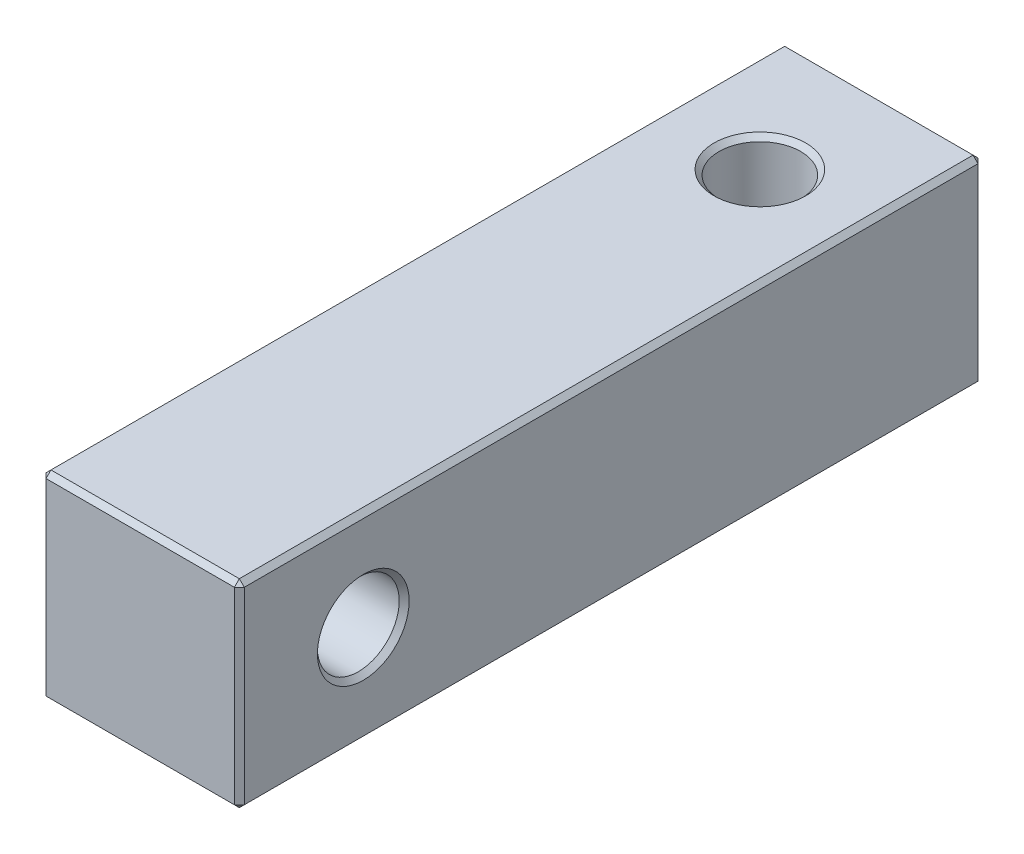
ISO-10303-21;
HEADER;
FILE_DESCRIPTION(('STEP AP214'),'2;1');
FILE_NAME('part.step','',(''),(''),'','','');
FILE_SCHEMA(('AUTOMOTIVE_DESIGN { 1 0 10303 214 1 1 1 1 }'));
ENDSEC;
DATA;
#1=APPLICATION_CONTEXT('core data for automotive mechanical design processes');
#2=APPLICATION_PROTOCOL_DEFINITION('international standard','automotive_design',2000,#1);
#3=PRODUCT_CONTEXT('',#1,'mechanical');
#4=PRODUCT('Part','Part','',(#3));
#5=PRODUCT_RELATED_PRODUCT_CATEGORY('part','',(#4));
#6=PRODUCT_DEFINITION_FORMATION('','',#4);
#7=PRODUCT_DEFINITION_CONTEXT('part definition',#1,'design');
#8=PRODUCT_DEFINITION('design','',#6,#7);
#9=PRODUCT_DEFINITION_SHAPE('','',#8);
#10=(LENGTH_UNIT() NAMED_UNIT(*) SI_UNIT(.MILLI.,.METRE.));
#11=(NAMED_UNIT(*) PLANE_ANGLE_UNIT() SI_UNIT($,.RADIAN.));
#12=(NAMED_UNIT(*) SI_UNIT($,.STERADIAN.) SOLID_ANGLE_UNIT());
#13=UNCERTAINTY_MEASURE_WITH_UNIT(LENGTH_MEASURE(1.E-05),#10,'distance_accuracy_value','');
#14=(GEOMETRIC_REPRESENTATION_CONTEXT(3) GLOBAL_UNCERTAINTY_ASSIGNED_CONTEXT((#13)) GLOBAL_UNIT_ASSIGNED_CONTEXT((#10,
#11,#12)) REPRESENTATION_CONTEXT('',''));
#15=CARTESIAN_POINT('',(0.,0.,0.));
#16=DIRECTION('',(0.,0.,1.));
#17=DIRECTION('',(1.,0.,0.));
#18=AXIS2_PLACEMENT_3D('',#15,#16,#17);
#19=CARTESIAN_POINT('',(4.,4.,15.));
#20=DIRECTION('',(-1.,0.,0.));
#21=DIRECTION('',(0.,-1.,0.));
#22=AXIS2_PLACEMENT_3D('',#19,#20,#21);
#23=PLANE('',#22);
#24=DIRECTION('',(0.,-1.,0.));
#25=VECTOR('',#24,1.);
#26=CARTESIAN_POINT('',(4.,-4.,14.8));
#27=LINE('',#26,#25);
#28=CARTESIAN_POINT('',(4.,3.8,14.8));
#29=VERTEX_POINT('',#28);
#30=CARTESIAN_POINT('',(4.,-3.8,14.8));
#31=VERTEX_POINT('',#30);
#32=EDGE_CURVE('E51',#29,#31,#27,.T.);
#33=ORIENTED_EDGE('',*,*,#32,.T.);
#34=DIRECTION('',(0.,0.,-1.));
#35=VECTOR('',#34,1.);
#36=CARTESIAN_POINT('',(4.,-3.8,15.));
#37=LINE('',#36,#35);
#38=CARTESIAN_POINT('',(4.,-3.8,-14.8));
#39=VERTEX_POINT('',#38);
#40=EDGE_CURVE('E11',#31,#39,#37,.T.);
#41=ORIENTED_EDGE('',*,*,#40,.T.);
#42=DIRECTION('',(0.,1.,0.));
#43=VECTOR('',#42,1.);
#44=CARTESIAN_POINT('',(4.,4.,-14.8));
#45=LINE('',#44,#43);
#46=CARTESIAN_POINT('',(4.,3.8,-14.8));
#47=VERTEX_POINT('',#46);
#48=EDGE_CURVE('E232',#39,#47,#45,.T.);
#49=ORIENTED_EDGE('',*,*,#48,.T.);
#50=DIRECTION('',(0.,0.,1.));
#51=VECTOR('',#50,1.);
#52=CARTESIAN_POINT('',(4.,3.8,15.));
#53=LINE('',#52,#51);
#54=EDGE_CURVE('E62',#47,#29,#53,.T.);
#55=ORIENTED_EDGE('',*,*,#54,.T.);
#56=EDGE_LOOP('',(#33,#41,#49,#55));
#57=FACE_BOUND('',#56,.T.);
#58=CARTESIAN_POINT('',(4.,0.,10.));
#59=DIRECTION('',(-1.,0.,0.));
#60=DIRECTION('',(0.,-1.,0.));
#61=AXIS2_PLACEMENT_3D('',#58,#59,#60);
#62=CIRCLE('',#61,1.85);
#63=CARTESIAN_POINT('',(4.,-1.85,10.));
#64=VERTEX_POINT('',#63);
#65=EDGE_CURVE('E229',#64,#64,#62,.T.);
#66=ORIENTED_EDGE('',*,*,#65,.T.);
#67=EDGE_LOOP('',(#66));
#68=FACE_BOUND('',#67,.T.);
#69=ADVANCED_FACE('F41',(#57,#68),#23,.F.);
#70=CARTESIAN_POINT('',(-4.,4.,15.));
#71=DIRECTION('',(0.,-1.,0.));
#72=DIRECTION('',(0.,0.,-1.));
#73=AXIS2_PLACEMENT_3D('',#70,#71,#72);
#74=PLANE('',#73);
#75=CARTESIAN_POINT('',(0.,4.,-10.));
#76=DIRECTION('',(0.,-1.,0.));
#77=DIRECTION('',(0.,0.,-1.));
#78=AXIS2_PLACEMENT_3D('',#75,#76,#77);
#79=CIRCLE('',#78,1.84999999999999);
#80=CARTESIAN_POINT('',(0.,4.,-11.85));
#81=VERTEX_POINT('',#80);
#82=EDGE_CURVE('E210',#81,#81,#79,.T.);
#83=ORIENTED_EDGE('',*,*,#82,.T.);
#84=EDGE_LOOP('',(#83));
#85=FACE_BOUND('',#84,.T.);
#86=DIRECTION('',(0.,0.,1.));
#87=VECTOR('',#86,1.);
#88=CARTESIAN_POINT('',(-3.8,4.,15.));
#89=LINE('',#88,#87);
#90=CARTESIAN_POINT('',(-3.8,4.,-14.8));
#91=VERTEX_POINT('',#90);
#92=CARTESIAN_POINT('',(-3.8,4.,14.8));
#93=VERTEX_POINT('',#92);
#94=EDGE_CURVE('E205',#91,#93,#89,.T.);
#95=ORIENTED_EDGE('',*,*,#94,.T.);
#96=DIRECTION('',(1.,0.,0.));
#97=VECTOR('',#96,1.);
#98=CARTESIAN_POINT('',(4.,4.,14.8));
#99=LINE('',#98,#97);
#100=CARTESIAN_POINT('',(3.8,4.,14.8));
#101=VERTEX_POINT('',#100);
#102=EDGE_CURVE('E207',#93,#101,#99,.T.);
#103=ORIENTED_EDGE('',*,*,#102,.T.);
#104=DIRECTION('',(0.,0.,-1.));
#105=VECTOR('',#104,1.);
#106=CARTESIAN_POINT('',(3.8,4.,15.));
#107=LINE('',#106,#105);
#108=CARTESIAN_POINT('',(3.8,4.,-14.8));
#109=VERTEX_POINT('',#108);
#110=EDGE_CURVE('E201',#101,#109,#107,.T.);
#111=ORIENTED_EDGE('',*,*,#110,.T.);
#112=DIRECTION('',(-1.,0.,0.));
#113=VECTOR('',#112,1.);
#114=CARTESIAN_POINT('',(-4.,4.,-14.8));
#115=LINE('',#114,#113);
#116=EDGE_CURVE('E203',#109,#91,#115,.T.);
#117=ORIENTED_EDGE('',*,*,#116,.T.);
#118=EDGE_LOOP('',(#95,#103,#111,#117));
#119=FACE_BOUND('',#118,.T.);
#120=ADVANCED_FACE('F332',(#85,#119),#74,.F.);
#121=CARTESIAN_POINT('',(-4.,4.,15.));
#122=DIRECTION('',(1.,0.,0.));
#123=DIRECTION('',(0.,1.,0.));
#124=AXIS2_PLACEMENT_3D('',#121,#122,#123);
#125=PLANE('',#124);
#126=CARTESIAN_POINT('',(-4.,0.,10.));
#127=DIRECTION('',(1.,0.,0.));
#128=DIRECTION('',(0.,1.,0.));
#129=AXIS2_PLACEMENT_3D('',#126,#127,#128);
#130=CIRCLE('',#129,1.85);
#131=CARTESIAN_POINT('',(-4.,1.85,10.));
#132=VERTEX_POINT('',#131);
#133=EDGE_CURVE('E192',#132,#132,#130,.T.);
#134=ORIENTED_EDGE('',*,*,#133,.T.);
#135=EDGE_LOOP('',(#134));
#136=FACE_BOUND('',#135,.T.);
#137=DIRECTION('',(0.,0.,1.));
#138=VECTOR('',#137,1.);
#139=CARTESIAN_POINT('',(-4.,-3.8,15.));
#140=LINE('',#139,#138);
#141=CARTESIAN_POINT('',(-4.,-3.8,-14.8));
#142=VERTEX_POINT('',#141);
#143=CARTESIAN_POINT('',(-4.,-3.8,14.8));
#144=VERTEX_POINT('',#143);
#145=EDGE_CURVE('E187',#142,#144,#140,.T.);
#146=ORIENTED_EDGE('',*,*,#145,.T.);
#147=DIRECTION('',(0.,1.,0.));
#148=VECTOR('',#147,1.);
#149=CARTESIAN_POINT('',(-4.,4.,14.8));
#150=LINE('',#149,#148);
#151=CARTESIAN_POINT('',(-4.,3.8,14.8));
#152=VERTEX_POINT('',#151);
#153=EDGE_CURVE('E189',#144,#152,#150,.T.);
#154=ORIENTED_EDGE('',*,*,#153,.T.);
#155=DIRECTION('',(0.,0.,-1.));
#156=VECTOR('',#155,1.);
#157=CARTESIAN_POINT('',(-4.,3.8,15.));
#158=LINE('',#157,#156);
#159=CARTESIAN_POINT('',(-4.,3.8,-14.8));
#160=VERTEX_POINT('',#159);
#161=EDGE_CURVE('E183',#152,#160,#158,.T.);
#162=ORIENTED_EDGE('',*,*,#161,.T.);
#163=DIRECTION('',(0.,-1.,0.));
#164=VECTOR('',#163,1.);
#165=CARTESIAN_POINT('',(-4.,4.,-14.8));
#166=LINE('',#165,#164);
#167=EDGE_CURVE('E185',#160,#142,#166,.T.);
#168=ORIENTED_EDGE('',*,*,#167,.T.);
#169=EDGE_LOOP('',(#146,#154,#162,#168));
#170=FACE_BOUND('',#169,.T.);
#171=ADVANCED_FACE('F360',(#136,#170),#125,.F.);
#172=CARTESIAN_POINT('',(-4.,-4.,15.));
#173=DIRECTION('',(0.,1.,0.));
#174=DIRECTION('',(0.,0.,1.));
#175=AXIS2_PLACEMENT_3D('',#172,#173,#174);
#176=PLANE('',#175);
#177=CARTESIAN_POINT('',(0.,-4.,-10.));
#178=DIRECTION('',(0.,1.,0.));
#179=DIRECTION('',(0.,0.,1.));
#180=AXIS2_PLACEMENT_3D('',#177,#178,#179);
#181=CIRCLE('',#180,1.85);
#182=CARTESIAN_POINT('',(0.,-4.,-8.15));
#183=VERTEX_POINT('',#182);
#184=EDGE_CURVE('E174',#183,#183,#181,.T.);
#185=ORIENTED_EDGE('',*,*,#184,.T.);
#186=EDGE_LOOP('',(#185));
#187=FACE_BOUND('',#186,.T.);
#188=DIRECTION('',(-1.,0.,0.));
#189=VECTOR('',#188,1.);
#190=CARTESIAN_POINT('',(-4.,-4.,14.8));
#191=LINE('',#190,#189);
#192=CARTESIAN_POINT('',(3.8,-4.,14.8));
#193=VERTEX_POINT('',#192);
#194=CARTESIAN_POINT('',(-3.8,-4.,14.8));
#195=VERTEX_POINT('',#194);
#196=EDGE_CURVE('E142',#193,#195,#191,.T.);
#197=ORIENTED_EDGE('',*,*,#196,.T.);
#198=DIRECTION('',(0.,0.,-1.));
#199=VECTOR('',#198,1.);
#200=CARTESIAN_POINT('',(-3.8,-4.,15.));
#201=LINE('',#200,#199);
#202=CARTESIAN_POINT('',(-3.8,-4.,-14.8));
#203=VERTEX_POINT('',#202);
#204=EDGE_CURVE('E138',#195,#203,#201,.T.);
#205=ORIENTED_EDGE('',*,*,#204,.T.);
#206=DIRECTION('',(1.,0.,0.));
#207=VECTOR('',#206,1.);
#208=CARTESIAN_POINT('',(-4.,-4.,-14.8));
#209=LINE('',#208,#207);
#210=CARTESIAN_POINT('',(3.8,-4.,-14.8));
#211=VERTEX_POINT('',#210);
#212=EDGE_CURVE('E130',#203,#211,#209,.T.);
#213=ORIENTED_EDGE('',*,*,#212,.T.);
#214=DIRECTION('',(0.,0.,1.));
#215=VECTOR('',#214,1.);
#216=CARTESIAN_POINT('',(3.8,-4.,15.));
#217=LINE('',#216,#215);
#218=EDGE_CURVE('E135',#211,#193,#217,.T.);
#219=ORIENTED_EDGE('',*,*,#218,.T.);
#220=EDGE_LOOP('',(#197,#205,#213,#219));
#221=FACE_BOUND('',#220,.T.);
#222=ADVANCED_FACE('F133',(#187,#221),#176,.F.);
#223=CARTESIAN_POINT('',(0.,0.,15.));
#224=DIRECTION('',(0.,0.,1.));
#225=DIRECTION('',(1.,0.,0.));
#226=AXIS2_PLACEMENT_3D('',#223,#224,#225);
#227=PLANE('',#226);
#228=DIRECTION('',(0.,-1.,0.));
#229=VECTOR('',#228,1.);
#230=CARTESIAN_POINT('',(-3.8,-4.,15.));
#231=LINE('',#230,#229);
#232=CARTESIAN_POINT('',(-3.8,3.8,15.));
#233=VERTEX_POINT('',#232);
#234=CARTESIAN_POINT('',(-3.8,-3.8,15.));
#235=VERTEX_POINT('',#234);
#236=EDGE_CURVE('E217',#233,#235,#231,.T.);
#237=ORIENTED_EDGE('',*,*,#236,.T.);
#238=DIRECTION('',(1.,0.,0.));
#239=VECTOR('',#238,1.);
#240=CARTESIAN_POINT('',(4.,-3.8,15.));
#241=LINE('',#240,#239);
#242=CARTESIAN_POINT('',(3.8,-3.8,15.));
#243=VERTEX_POINT('',#242);
#244=EDGE_CURVE('E219',#235,#243,#241,.T.);
#245=ORIENTED_EDGE('',*,*,#244,.T.);
#246=DIRECTION('',(0.,1.,0.));
#247=VECTOR('',#246,1.);
#248=CARTESIAN_POINT('',(3.8,4.,15.));
#249=LINE('',#248,#247);
#250=CARTESIAN_POINT('',(3.8,3.8,15.));
#251=VERTEX_POINT('',#250);
#252=EDGE_CURVE('E213',#243,#251,#249,.T.);
#253=ORIENTED_EDGE('',*,*,#252,.T.);
#254=DIRECTION('',(-1.,0.,0.));
#255=VECTOR('',#254,1.);
#256=CARTESIAN_POINT('',(-4.,3.8,15.));
#257=LINE('',#256,#255);
#258=EDGE_CURVE('E215',#251,#233,#257,.T.);
#259=ORIENTED_EDGE('',*,*,#258,.T.);
#260=EDGE_LOOP('',(#237,#245,#253,#259));
#261=FACE_BOUND('',#260,.T.);
#262=ADVANCED_FACE('F352',(#261),#227,.T.);
#263=CARTESIAN_POINT('',(0.,0.,-15.));
#264=DIRECTION('',(0.,0.,1.));
#265=DIRECTION('',(1.,0.,0.));
#266=AXIS2_PLACEMENT_3D('',#263,#264,#265);
#267=PLANE('',#266);
#268=DIRECTION('',(0.,-1.,0.));
#269=VECTOR('',#268,1.);
#270=CARTESIAN_POINT('',(3.8,0.,-15.));
#271=LINE('',#270,#269);
#272=CARTESIAN_POINT('',(3.8,3.8,-15.));
#273=VERTEX_POINT('',#272);
#274=CARTESIAN_POINT('',(3.8,-3.8,-15.));
#275=VERTEX_POINT('',#274);
#276=EDGE_CURVE('E222',#273,#275,#271,.T.);
#277=ORIENTED_EDGE('',*,*,#276,.T.);
#278=DIRECTION('',(-1.,0.,0.));
#279=VECTOR('',#278,1.);
#280=CARTESIAN_POINT('',(0.,-3.8,-15.));
#281=LINE('',#280,#279);
#282=CARTESIAN_POINT('',(-3.8,-3.8,-15.));
#283=VERTEX_POINT('',#282);
#284=EDGE_CURVE('E150',#275,#283,#281,.T.);
#285=ORIENTED_EDGE('',*,*,#284,.T.);
#286=DIRECTION('',(0.,1.,0.));
#287=VECTOR('',#286,1.);
#288=CARTESIAN_POINT('',(-3.8,0.,-15.));
#289=LINE('',#288,#287);
#290=CARTESIAN_POINT('',(-3.8,3.8,-15.));
#291=VERTEX_POINT('',#290);
#292=EDGE_CURVE('E226',#283,#291,#289,.T.);
#293=ORIENTED_EDGE('',*,*,#292,.T.);
#294=DIRECTION('',(1.,0.,0.));
#295=VECTOR('',#294,1.);
#296=CARTESIAN_POINT('',(0.,3.8,-15.));
#297=LINE('',#296,#295);
#298=EDGE_CURVE('E224',#291,#273,#297,.T.);
#299=ORIENTED_EDGE('',*,*,#298,.T.);
#300=EDGE_LOOP('',(#277,#285,#293,#299));
#301=FACE_BOUND('',#300,.T.);
#302=ADVANCED_FACE('F327',(#301),#267,.F.);
#303=CARTESIAN_POINT('',(4.,0.,10.));
#304=DIRECTION('',(1.,0.,0.));
#305=DIRECTION('',(0.,0.,-1.));
#306=AXIS2_PLACEMENT_3D('',#303,#304,#305);
#307=CYLINDRICAL_SURFACE('',#306,1.65);
#308=CARTESIAN_POINT('',(-3.8,0.,10.));
#309=DIRECTION('',(1.,0.,0.));
#310=DIRECTION('',(0.,0.,-1.));
#311=AXIS2_PLACEMENT_3D('',#308,#309,#310);
#312=CIRCLE('',#311,1.65);
#313=CARTESIAN_POINT('',(-3.8,0.,8.35));
#314=VERTEX_POINT('',#313);
#315=EDGE_CURVE('E198',#314,#314,#312,.F.);
#316=ORIENTED_EDGE('',*,*,#315,.T.);
#317=EDGE_LOOP('',(#316));
#318=FACE_BOUND('',#317,.T.);
#319=CARTESIAN_POINT('',(3.8,0.,10.));
#320=DIRECTION('',(-1.,0.,0.));
#321=DIRECTION('',(0.,0.,1.));
#322=AXIS2_PLACEMENT_3D('',#319,#320,#321);
#323=CIRCLE('',#322,1.65);
#324=CARTESIAN_POINT('',(3.8,0.,11.65));
#325=VERTEX_POINT('',#324);
#326=EDGE_CURVE('E195',#325,#325,#323,.F.);
#327=ORIENTED_EDGE('',*,*,#326,.T.);
#328=EDGE_LOOP('',(#327));
#329=FACE_BOUND('',#328,.T.);
#330=ADVANCED_FACE('F340',(#318,#329),#307,.F.);
#331=CARTESIAN_POINT('',(0.,4.,-10.));
#332=DIRECTION('',(0.,1.,0.));
#333=DIRECTION('',(0.,0.,1.));
#334=AXIS2_PLACEMENT_3D('',#331,#332,#333);
#335=CYLINDRICAL_SURFACE('',#334,1.65);
#336=CARTESIAN_POINT('',(0.,-3.8,-10.));
#337=DIRECTION('',(0.,1.,0.));
#338=DIRECTION('',(0.,0.,1.));
#339=AXIS2_PLACEMENT_3D('',#336,#337,#338);
#340=CIRCLE('',#339,1.65);
#341=CARTESIAN_POINT('',(0.,-3.8,-8.35));
#342=VERTEX_POINT('',#341);
#343=EDGE_CURVE('E180',#342,#342,#340,.F.);
#344=ORIENTED_EDGE('',*,*,#343,.T.);
#345=EDGE_LOOP('',(#344));
#346=FACE_BOUND('',#345,.T.);
#347=CARTESIAN_POINT('',(0.,3.8,-10.));
#348=DIRECTION('',(0.,-1.,0.));
#349=DIRECTION('',(0.,0.,-1.));
#350=AXIS2_PLACEMENT_3D('',#347,#348,#349);
#351=CIRCLE('',#350,1.65);
#352=CARTESIAN_POINT('',(0.,3.8,-11.65));
#353=VERTEX_POINT('',#352);
#354=EDGE_CURVE('E177',#353,#353,#351,.F.);
#355=ORIENTED_EDGE('',*,*,#354,.T.);
#356=EDGE_LOOP('',(#355));
#357=FACE_BOUND('',#356,.T.);
#358=ADVANCED_FACE('F342',(#346,#357),#335,.F.);
#359=CARTESIAN_POINT('',(0.,-4.,-10.));
#360=DIRECTION('',(0.,-1.,0.));
#361=DIRECTION('',(0.,0.,-1.));
#362=AXIS2_PLACEMENT_3D('',#359,#360,#361);
#363=CONICAL_SURFACE('',#362,1.85,0.785398163397441);
#364=ORIENTED_EDGE('',*,*,#343,.F.);
#365=EDGE_LOOP('',(#364));
#366=FACE_BOUND('',#365,.T.);
#367=ORIENTED_EDGE('',*,*,#184,.F.);
#368=EDGE_LOOP('',(#367));
#369=FACE_BOUND('',#368,.T.);
#370=ADVANCED_FACE('F349',(#366,#369),#363,.F.);
#371=CARTESIAN_POINT('',(-4.,0.,10.));
#372=DIRECTION('',(-1.,0.,0.));
#373=DIRECTION('',(0.,0.,1.));
#374=AXIS2_PLACEMENT_3D('',#371,#372,#373);
#375=CONICAL_SURFACE('',#374,1.85,0.785398163397443);
#376=ORIENTED_EDGE('',*,*,#315,.F.);
#377=EDGE_LOOP('',(#376));
#378=FACE_BOUND('',#377,.T.);
#379=ORIENTED_EDGE('',*,*,#133,.F.);
#380=EDGE_LOOP('',(#379));
#381=FACE_BOUND('',#380,.T.);
#382=ADVANCED_FACE('F374',(#378,#381),#375,.F.);
#383=CARTESIAN_POINT('',(0.,3.8,-10.));
#384=DIRECTION('',(0.,1.,0.));
#385=DIRECTION('',(0.,0.,1.));
#386=AXIS2_PLACEMENT_3D('',#383,#384,#385);
#387=CONICAL_SURFACE('',#386,1.65,0.785398163397443);
#388=ORIENTED_EDGE('',*,*,#82,.F.);
#389=EDGE_LOOP('',(#388));
#390=FACE_BOUND('',#389,.T.);
#391=ORIENTED_EDGE('',*,*,#354,.F.);
#392=EDGE_LOOP('',(#391));
#393=FACE_BOUND('',#392,.T.);
#394=ADVANCED_FACE('F381',(#390,#393),#387,.F.);
#395=CARTESIAN_POINT('',(-4.,4.,-14.8));
#396=DIRECTION('',(0.,-0.707106781186548,0.707106781186548));
#397=DIRECTION('',(-1.,0.,0.));
#398=AXIS2_PLACEMENT_3D('',#395,#396,#397);
#399=PLANE('',#398);
#400=DIRECTION('',(0.,0.707106781186547,0.707106781186547));
#401=VECTOR('',#400,1.);
#402=CARTESIAN_POINT('',(-3.8,3.8,-15.));
#403=LINE('',#402,#401);
#404=EDGE_CURVE('E46',#91,#291,#403,.F.);
#405=ORIENTED_EDGE('',*,*,#404,.F.);
#406=ORIENTED_EDGE('',*,*,#116,.F.);
#407=DIRECTION('',(0.,-0.707106781186547,-0.707106781186547));
#408=VECTOR('',#407,1.);
#409=CARTESIAN_POINT('',(3.8,3.8,-15.));
#410=LINE('',#409,#408);
#411=EDGE_CURVE('E170',#273,#109,#410,.F.);
#412=ORIENTED_EDGE('',*,*,#411,.F.);
#413=ORIENTED_EDGE('',*,*,#298,.F.);
#414=EDGE_LOOP('',(#405,#406,#412,#413));
#415=FACE_BOUND('',#414,.T.);
#416=ADVANCED_FACE('F388',(#415),#399,.F.);
#417=CARTESIAN_POINT('',(-3.8,3.8,-15.));
#418=DIRECTION('',(-0.577350269189626,0.577350269189626,-0.577350269189626));
#419=DIRECTION('',(-0.707106781186548,0.,0.707106781186548));
#420=AXIS2_PLACEMENT_3D('',#417,#418,#419);
#421=PLANE('',#420);
#422=DIRECTION('',(-0.707106781186547,-0.707106781186547,0.));
#423=VECTOR('',#422,1.);
#424=CARTESIAN_POINT('',(-3.9,3.9,-14.8));
#425=LINE('',#424,#423);
#426=EDGE_CURVE('E277',#91,#160,#425,.T.);
#427=ORIENTED_EDGE('',*,*,#426,.F.);
#428=ORIENTED_EDGE('',*,*,#404,.T.);
#429=DIRECTION('',(0.707106781186548,0.,-0.707106781186548));
#430=VECTOR('',#429,1.);
#431=CARTESIAN_POINT('',(-3.8,3.8,-15.));
#432=LINE('',#431,#430);
#433=EDGE_CURVE('E280',#160,#291,#432,.T.);
#434=ORIENTED_EDGE('',*,*,#433,.F.);
#435=EDGE_LOOP('',(#427,#428,#434));
#436=FACE_BOUND('',#435,.T.);
#437=ADVANCED_FACE('F489',(#436),#421,.T.);
#438=CARTESIAN_POINT('',(3.8,3.8,-15.));
#439=DIRECTION('',(0.577350269189626,0.577350269189626,-0.577350269189626));
#440=DIRECTION('',(-0.707106781186548,0.,-0.707106781186548));
#441=AXIS2_PLACEMENT_3D('',#438,#439,#440);
#442=PLANE('',#441);
#443=DIRECTION('',(0.707106781186548,0.,0.707106781186548));
#444=VECTOR('',#443,1.);
#445=CARTESIAN_POINT('',(3.8,3.8,-15.));
#446=LINE('',#445,#444);
#447=EDGE_CURVE('E271',#273,#47,#446,.T.);
#448=ORIENTED_EDGE('',*,*,#447,.F.);
#449=ORIENTED_EDGE('',*,*,#411,.T.);
#450=DIRECTION('',(-0.707106781186547,0.707106781186547,0.));
#451=VECTOR('',#450,1.);
#452=CARTESIAN_POINT('',(3.9,3.9,-14.8));
#453=LINE('',#452,#451);
#454=EDGE_CURVE('E274',#47,#109,#453,.T.);
#455=ORIENTED_EDGE('',*,*,#454,.F.);
#456=EDGE_LOOP('',(#448,#449,#455));
#457=FACE_BOUND('',#456,.T.);
#458=ADVANCED_FACE('F287',(#457),#442,.T.);
#459=CARTESIAN_POINT('',(-4.,4.,-14.8));
#460=DIRECTION('',(0.707106781186548,0.,0.707106781186548));
#461=DIRECTION('',(0.,-1.,0.));
#462=AXIS2_PLACEMENT_3D('',#459,#460,#461);
#463=PLANE('',#462);
#464=ORIENTED_EDGE('',*,*,#433,.T.);
#465=ORIENTED_EDGE('',*,*,#292,.F.);
#466=DIRECTION('',(-0.707106781186547,0.,0.707106781186547));
#467=VECTOR('',#466,1.);
#468=CARTESIAN_POINT('',(-3.8,-3.8,-15.));
#469=LINE('',#468,#467);
#470=EDGE_CURVE('E267',#142,#283,#469,.F.);
#471=ORIENTED_EDGE('',*,*,#470,.F.);
#472=ORIENTED_EDGE('',*,*,#167,.F.);
#473=EDGE_LOOP('',(#464,#465,#471,#472));
#474=FACE_BOUND('',#473,.T.);
#475=ADVANCED_FACE('F323',(#474),#463,.F.);
#476=CARTESIAN_POINT('',(-4.,3.8,15.));
#477=DIRECTION('',(0.707106781186548,-0.707106781186548,0.));
#478=DIRECTION('',(0.,0.,-1.));
#479=AXIS2_PLACEMENT_3D('',#476,#477,#478);
#480=PLANE('',#479);
#481=ORIENTED_EDGE('',*,*,#426,.T.);
#482=ORIENTED_EDGE('',*,*,#161,.F.);
#483=DIRECTION('',(0.707106781186547,0.707106781186547,0.));
#484=VECTOR('',#483,1.);
#485=CARTESIAN_POINT('',(-4.,3.8,14.8));
#486=LINE('',#485,#484);
#487=EDGE_CURVE('E264',#93,#152,#486,.F.);
#488=ORIENTED_EDGE('',*,*,#487,.F.);
#489=ORIENTED_EDGE('',*,*,#94,.F.);
#490=EDGE_LOOP('',(#481,#482,#488,#489));
#491=FACE_BOUND('',#490,.T.);
#492=ADVANCED_FACE('F471',(#491),#480,.F.);
#493=CARTESIAN_POINT('',(0.,3.8,15.));
#494=DIRECTION('',(0.,0.707106781186548,0.707106781186548));
#495=DIRECTION('',(1.,0.,0.));
#496=AXIS2_PLACEMENT_3D('',#493,#494,#495);
#497=PLANE('',#496);
#498=DIRECTION('',(0.,-0.707106781186547,0.707106781186547));
#499=VECTOR('',#498,1.);
#500=CARTESIAN_POINT('',(3.8,4.,14.8));
#501=LINE('',#500,#499);
#502=EDGE_CURVE('E258',#101,#251,#501,.T.);
#503=ORIENTED_EDGE('',*,*,#502,.F.);
#504=ORIENTED_EDGE('',*,*,#102,.F.);
#505=DIRECTION('',(0.,0.707106781186547,-0.707106781186547));
#506=VECTOR('',#505,1.);
#507=CARTESIAN_POINT('',(-3.8,3.9,14.9));
#508=LINE('',#507,#506);
#509=EDGE_CURVE('E261',#233,#93,#508,.T.);
#510=ORIENTED_EDGE('',*,*,#509,.F.);
#511=ORIENTED_EDGE('',*,*,#258,.F.);
#512=EDGE_LOOP('',(#503,#504,#510,#511));
#513=FACE_BOUND('',#512,.T.);
#514=ADVANCED_FACE('F465',(#513),#497,.T.);
#515=CARTESIAN_POINT('',(3.8,4.,15.));
#516=DIRECTION('',(-0.707106781186548,-0.707106781186548,0.));
#517=DIRECTION('',(0.,0.,-1.));
#518=AXIS2_PLACEMENT_3D('',#515,#516,#517);
#519=PLANE('',#518);
#520=ORIENTED_EDGE('',*,*,#454,.T.);
#521=ORIENTED_EDGE('',*,*,#110,.F.);
#522=DIRECTION('',(0.707106781186547,-0.707106781186547,0.));
#523=VECTOR('',#522,1.);
#524=CARTESIAN_POINT('',(3.8,4.,14.8));
#525=LINE('',#524,#523);
#526=EDGE_CURVE('E256',#29,#101,#525,.F.);
#527=ORIENTED_EDGE('',*,*,#526,.F.);
#528=ORIENTED_EDGE('',*,*,#54,.F.);
#529=EDGE_LOOP('',(#520,#521,#527,#528));
#530=FACE_BOUND('',#529,.T.);
#531=ADVANCED_FACE('F294',(#530),#519,.F.);
#532=CARTESIAN_POINT('',(4.,4.,-14.8));
#533=DIRECTION('',(-0.707106781186548,0.,0.707106781186548));
#534=DIRECTION('',(0.,1.,0.));
#535=AXIS2_PLACEMENT_3D('',#532,#533,#534);
#536=PLANE('',#535);
#537=ORIENTED_EDGE('',*,*,#447,.T.);
#538=ORIENTED_EDGE('',*,*,#48,.F.);
#539=DIRECTION('',(-0.707106781186547,0.,-0.707106781186547));
#540=VECTOR('',#539,1.);
#541=CARTESIAN_POINT('',(3.9,-3.8,-14.9));
#542=LINE('',#541,#540);
#543=EDGE_CURVE('E154',#275,#39,#542,.F.);
#544=ORIENTED_EDGE('',*,*,#543,.F.);
#545=ORIENTED_EDGE('',*,*,#276,.F.);
#546=EDGE_LOOP('',(#537,#538,#544,#545));
#547=FACE_BOUND('',#546,.T.);
#548=ADVANCED_FACE('F329',(#547),#536,.F.);
#549=CARTESIAN_POINT('',(-4.,-4.,-14.8));
#550=DIRECTION('',(0.,0.707106781186548,0.707106781186548));
#551=DIRECTION('',(1.,0.,0.));
#552=AXIS2_PLACEMENT_3D('',#549,#550,#551);
#553=PLANE('',#552);
#554=DIRECTION('',(0.,0.707106781186547,-0.707106781186547));
#555=VECTOR('',#554,1.);
#556=CARTESIAN_POINT('',(-3.8,-3.8,-15.));
#557=LINE('',#556,#555);
#558=EDGE_CURVE('E269',#283,#203,#557,.F.);
#559=ORIENTED_EDGE('',*,*,#558,.F.);
#560=ORIENTED_EDGE('',*,*,#284,.F.);
#561=DIRECTION('',(0.,-0.707106781186547,0.707106781186547));
#562=VECTOR('',#561,1.);
#563=CARTESIAN_POINT('',(3.8,-4.,-14.8));
#564=LINE('',#563,#562);
#565=EDGE_CURVE('E146',#211,#275,#564,.F.);
#566=ORIENTED_EDGE('',*,*,#565,.F.);
#567=ORIENTED_EDGE('',*,*,#212,.F.);
#568=EDGE_LOOP('',(#559,#560,#566,#567));
#569=FACE_BOUND('',#568,.T.);
#570=ADVANCED_FACE('F148',(#569),#553,.F.);
#571=CARTESIAN_POINT('',(-3.8,-3.8,-15.));
#572=DIRECTION('',(-0.577350269189626,-0.577350269189626,-0.577350269189626));
#573=DIRECTION('',(-0.707106781186548,0.,0.707106781186548));
#574=AXIS2_PLACEMENT_3D('',#571,#572,#573);
#575=PLANE('',#574);
#576=ORIENTED_EDGE('',*,*,#470,.T.);
#577=ORIENTED_EDGE('',*,*,#558,.T.);
#578=DIRECTION('',(0.707106781186547,-0.707106781186547,0.));
#579=VECTOR('',#578,1.);
#580=CARTESIAN_POINT('',(-3.9,-3.9,-14.8));
#581=LINE('',#580,#579);
#582=EDGE_CURVE('E155',#142,#203,#581,.T.);
#583=ORIENTED_EDGE('',*,*,#582,.F.);
#584=EDGE_LOOP('',(#576,#577,#583));
#585=FACE_BOUND('',#584,.T.);
#586=ADVANCED_FACE('F319',(#585),#575,.T.);
#587=CARTESIAN_POINT('',(-4.,3.8,14.8));
#588=DIRECTION('',(-0.577350269189626,0.577350269189626,0.577350269189626));
#589=DIRECTION('',(0.707106781186548,0.,0.707106781186548));
#590=AXIS2_PLACEMENT_3D('',#587,#588,#589);
#591=PLANE('',#590);
#592=ORIENTED_EDGE('',*,*,#509,.T.);
#593=ORIENTED_EDGE('',*,*,#487,.T.);
#594=DIRECTION('',(0.707106781186548,0.,0.707106781186548));
#595=VECTOR('',#594,1.);
#596=CARTESIAN_POINT('',(-4.,3.8,14.8));
#597=LINE('',#596,#595);
#598=EDGE_CURVE('E251',#233,#152,#597,.F.);
#599=ORIENTED_EDGE('',*,*,#598,.F.);
#600=EDGE_LOOP('',(#592,#593,#599));
#601=FACE_BOUND('',#600,.T.);
#602=ADVANCED_FACE('F438',(#601),#591,.T.);
#603=CARTESIAN_POINT('',(3.8,4.,14.8));
#604=DIRECTION('',(0.577350269189626,0.577350269189626,0.577350269189626));
#605=DIRECTION('',(0.707106781186548,0.,-0.707106781186548));
#606=AXIS2_PLACEMENT_3D('',#603,#604,#605);
#607=PLANE('',#606);
#608=ORIENTED_EDGE('',*,*,#526,.T.);
#609=ORIENTED_EDGE('',*,*,#502,.T.);
#610=DIRECTION('',(0.707106781186548,0.,-0.707106781186548));
#611=VECTOR('',#610,1.);
#612=CARTESIAN_POINT('',(3.9,3.8,14.9));
#613=LINE('',#612,#611);
#614=EDGE_CURVE('E161',#29,#251,#613,.F.);
#615=ORIENTED_EDGE('',*,*,#614,.F.);
#616=EDGE_LOOP('',(#608,#609,#615));
#617=FACE_BOUND('',#616,.T.);
#618=ADVANCED_FACE('F298',(#617),#607,.T.);
#619=CARTESIAN_POINT('',(3.8,-4.,-14.8));
#620=DIRECTION('',(0.577350269189626,-0.577350269189626,-0.577350269189626));
#621=DIRECTION('',(-0.707106781186548,0.,-0.707106781186548));
#622=AXIS2_PLACEMENT_3D('',#619,#620,#621);
#623=PLANE('',#622);
#624=ORIENTED_EDGE('',*,*,#565,.T.);
#625=ORIENTED_EDGE('',*,*,#543,.T.);
#626=DIRECTION('',(0.707106781186547,0.707106781186547,0.));
#627=VECTOR('',#626,1.);
#628=CARTESIAN_POINT('',(3.8,-4.,-14.8));
#629=LINE('',#628,#627);
#630=EDGE_CURVE('E157',#211,#39,#629,.T.);
#631=ORIENTED_EDGE('',*,*,#630,.F.);
#632=EDGE_LOOP('',(#624,#625,#631));
#633=FACE_BOUND('',#632,.T.);
#634=ADVANCED_FACE('F158',(#633),#623,.T.);
#635=CARTESIAN_POINT('',(-3.8,-4.,15.));
#636=DIRECTION('',(0.707106781186548,0.707106781186548,0.));
#637=DIRECTION('',(0.,0.,-1.));
#638=AXIS2_PLACEMENT_3D('',#635,#636,#637);
#639=PLANE('',#638);
#640=ORIENTED_EDGE('',*,*,#582,.T.);
#641=ORIENTED_EDGE('',*,*,#204,.F.);
#642=DIRECTION('',(-0.707106781186547,0.707106781186547,0.));
#643=VECTOR('',#642,1.);
#644=CARTESIAN_POINT('',(-3.8,-4.,14.8));
#645=LINE('',#644,#643);
#646=EDGE_CURVE('E162',#144,#195,#645,.F.);
#647=ORIENTED_EDGE('',*,*,#646,.F.);
#648=ORIENTED_EDGE('',*,*,#145,.F.);
#649=EDGE_LOOP('',(#640,#641,#647,#648));
#650=FACE_BOUND('',#649,.T.);
#651=ADVANCED_FACE('F316',(#650),#639,.F.);
#652=CARTESIAN_POINT('',(-3.8,0.,15.));
#653=DIRECTION('',(-0.707106781186548,0.,0.707106781186548));
#654=DIRECTION('',(0.,1.,0.));
#655=AXIS2_PLACEMENT_3D('',#652,#653,#654);
#656=PLANE('',#655);
#657=ORIENTED_EDGE('',*,*,#598,.T.);
#658=ORIENTED_EDGE('',*,*,#153,.F.);
#659=DIRECTION('',(-0.707106781186547,0.,-0.707106781186547));
#660=VECTOR('',#659,1.);
#661=CARTESIAN_POINT('',(-3.9,-3.8,14.9));
#662=LINE('',#661,#660);
#663=EDGE_CURVE('E244',#235,#144,#662,.T.);
#664=ORIENTED_EDGE('',*,*,#663,.F.);
#665=ORIENTED_EDGE('',*,*,#236,.F.);
#666=EDGE_LOOP('',(#657,#658,#664,#665));
#667=FACE_BOUND('',#666,.T.);
#668=ADVANCED_FACE('F416',(#667),#656,.T.);
#669=CARTESIAN_POINT('',(3.8,0.,15.));
#670=DIRECTION('',(0.707106781186548,0.,0.707106781186548));
#671=DIRECTION('',(0.,-1.,0.));
#672=AXIS2_PLACEMENT_3D('',#669,#670,#671);
#673=PLANE('',#672);
#674=ORIENTED_EDGE('',*,*,#614,.T.);
#675=ORIENTED_EDGE('',*,*,#252,.F.);
#676=DIRECTION('',(-0.707106781186547,0.,0.707106781186547));
#677=VECTOR('',#676,1.);
#678=CARTESIAN_POINT('',(3.8,-3.8,15.));
#679=LINE('',#678,#677);
#680=EDGE_CURVE('E241',#31,#243,#679,.T.);
#681=ORIENTED_EDGE('',*,*,#680,.F.);
#682=ORIENTED_EDGE('',*,*,#32,.F.);
#683=EDGE_LOOP('',(#674,#675,#681,#682));
#684=FACE_BOUND('',#683,.T.);
#685=ADVANCED_FACE('F302',(#684),#673,.T.);
#686=CARTESIAN_POINT('',(4.,-3.8,15.));
#687=DIRECTION('',(-0.707106781186548,0.707106781186548,0.));
#688=DIRECTION('',(0.,0.,-1.));
#689=AXIS2_PLACEMENT_3D('',#686,#687,#688);
#690=PLANE('',#689);
#691=ORIENTED_EDGE('',*,*,#630,.T.);
#692=ORIENTED_EDGE('',*,*,#40,.F.);
#693=DIRECTION('',(-0.707106781186547,-0.707106781186547,0.));
#694=VECTOR('',#693,1.);
#695=CARTESIAN_POINT('',(3.9,-3.9,14.8));
#696=LINE('',#695,#694);
#697=EDGE_CURVE('E166',#193,#31,#696,.F.);
#698=ORIENTED_EDGE('',*,*,#697,.F.);
#699=ORIENTED_EDGE('',*,*,#218,.F.);
#700=EDGE_LOOP('',(#691,#692,#698,#699));
#701=FACE_BOUND('',#700,.T.);
#702=ADVANCED_FACE('F164',(#701),#690,.F.);
#703=CARTESIAN_POINT('',(-3.8,-4.,14.8));
#704=DIRECTION('',(-0.577350269189626,-0.577350269189626,0.577350269189626));
#705=DIRECTION('',(0.707106781186548,0.,0.707106781186548));
#706=AXIS2_PLACEMENT_3D('',#703,#704,#705);
#707=PLANE('',#706);
#708=ORIENTED_EDGE('',*,*,#663,.T.);
#709=ORIENTED_EDGE('',*,*,#646,.T.);
#710=DIRECTION('',(0.,0.707106781186547,0.707106781186547));
#711=VECTOR('',#710,1.);
#712=CARTESIAN_POINT('',(-3.8,-4.,14.8));
#713=LINE('',#712,#711);
#714=EDGE_CURVE('E238',#235,#195,#713,.F.);
#715=ORIENTED_EDGE('',*,*,#714,.F.);
#716=EDGE_LOOP('',(#708,#709,#715));
#717=FACE_BOUND('',#716,.T.);
#718=ADVANCED_FACE('F312',(#717),#707,.T.);
#719=CARTESIAN_POINT('',(3.8,-3.8,15.));
#720=DIRECTION('',(0.577350269189626,-0.577350269189626,0.577350269189626));
#721=DIRECTION('',(0.707106781186548,0.,-0.707106781186548));
#722=AXIS2_PLACEMENT_3D('',#719,#720,#721);
#723=PLANE('',#722);
#724=ORIENTED_EDGE('',*,*,#697,.T.);
#725=ORIENTED_EDGE('',*,*,#680,.T.);
#726=DIRECTION('',(0.,-0.707106781186547,-0.707106781186547));
#727=VECTOR('',#726,1.);
#728=CARTESIAN_POINT('',(3.8,-3.8,15.));
#729=LINE('',#728,#727);
#730=EDGE_CURVE('E236',#193,#243,#729,.F.);
#731=ORIENTED_EDGE('',*,*,#730,.F.);
#732=EDGE_LOOP('',(#724,#725,#731));
#733=FACE_BOUND('',#732,.T.);
#734=ADVANCED_FACE('F305',(#733),#723,.T.);
#735=CARTESIAN_POINT('',(0.,-3.8,15.));
#736=DIRECTION('',(0.,-0.707106781186548,0.707106781186548));
#737=DIRECTION('',(-1.,0.,0.));
#738=AXIS2_PLACEMENT_3D('',#735,#736,#737);
#739=PLANE('',#738);
#740=ORIENTED_EDGE('',*,*,#714,.T.);
#741=ORIENTED_EDGE('',*,*,#196,.F.);
#742=ORIENTED_EDGE('',*,*,#730,.T.);
#743=ORIENTED_EDGE('',*,*,#244,.F.);
#744=EDGE_LOOP('',(#740,#741,#742,#743));
#745=FACE_BOUND('',#744,.T.);
#746=ADVANCED_FACE('F308',(#745),#739,.T.);
#747=CARTESIAN_POINT('',(3.8,0.,10.));
#748=DIRECTION('',(1.,0.,0.));
#749=DIRECTION('',(0.,0.,-1.));
#750=AXIS2_PLACEMENT_3D('',#747,#748,#749);
#751=CONICAL_SURFACE('',#750,1.65,0.785398163397455);
#752=ORIENTED_EDGE('',*,*,#65,.F.);
#753=EDGE_LOOP('',(#752));
#754=FACE_BOUND('',#753,.T.);
#755=ORIENTED_EDGE('',*,*,#326,.F.);
#756=EDGE_LOOP('',(#755));
#757=FACE_BOUND('',#756,.T.);
#758=ADVANCED_FACE('F44',(#754,#757),#751,.F.);
#759=CLOSED_SHELL('',(#69,#120,#171,#222,#262,#302,#330,#358,#370,#382,#394,#416,#437,#458,#475,
#492,#514,#531,#548,#570,#586,#602,#618,#634,#651,#668,#685,#702,#718,#734,#746,#758));
#760=MANIFOLD_SOLID_BREP('B2',#759);
#761=ADVANCED_BREP_SHAPE_REPRESENTATION('',(#18,#760),#14);
#762=SHAPE_DEFINITION_REPRESENTATION(#9,#761);
ENDSEC;
END-ISO-10303-21;
